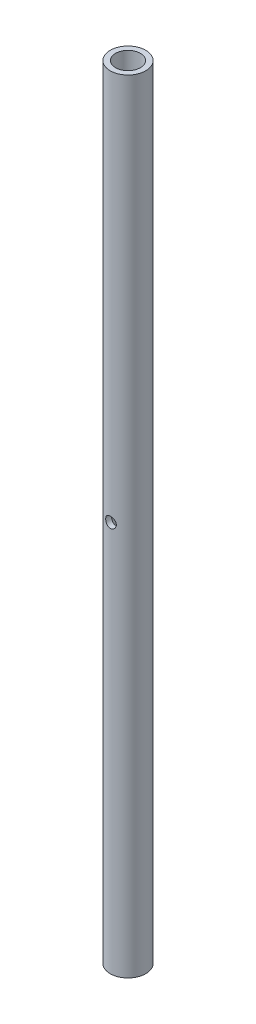
ISO-10303-21;
HEADER;
FILE_DESCRIPTION(('STEP AP214'),'2;1');
FILE_NAME('part.step','',(''),(''),'','','');
FILE_SCHEMA(('AUTOMOTIVE_DESIGN { 1 0 10303 214 1 1 1 1 }'));
ENDSEC;
DATA;
#1=APPLICATION_CONTEXT('core data for automotive mechanical design processes');
#2=APPLICATION_PROTOCOL_DEFINITION('international standard','automotive_design',2000,#1);
#3=PRODUCT_CONTEXT('',#1,'mechanical');
#4=PRODUCT('Part','Part','',(#3));
#5=PRODUCT_RELATED_PRODUCT_CATEGORY('part','',(#4));
#6=PRODUCT_DEFINITION_FORMATION('','',#4);
#7=PRODUCT_DEFINITION_CONTEXT('part definition',#1,'design');
#8=PRODUCT_DEFINITION('design','',#6,#7);
#9=PRODUCT_DEFINITION_SHAPE('','',#8);
#10=(LENGTH_UNIT() NAMED_UNIT(*) SI_UNIT(.MILLI.,.METRE.));
#11=(NAMED_UNIT(*) PLANE_ANGLE_UNIT() SI_UNIT($,.RADIAN.));
#12=(NAMED_UNIT(*) SI_UNIT($,.STERADIAN.) SOLID_ANGLE_UNIT());
#13=UNCERTAINTY_MEASURE_WITH_UNIT(LENGTH_MEASURE(1.E-05),#10,'distance_accuracy_value','');
#14=(GEOMETRIC_REPRESENTATION_CONTEXT(3) GLOBAL_UNCERTAINTY_ASSIGNED_CONTEXT((#13)) GLOBAL_UNIT_ASSIGNED_CONTEXT((#10,
#11,#12)) REPRESENTATION_CONTEXT('',''));
#15=CARTESIAN_POINT('',(0.,0.,0.));
#16=DIRECTION('',(0.,0.,1.));
#17=DIRECTION('',(1.,0.,0.));
#18=AXIS2_PLACEMENT_3D('',#15,#16,#17);
#19=CARTESIAN_POINT('',(0.,220.,0.));
#20=DIRECTION('',(0.,1.,0.));
#21=DIRECTION('',(0.,0.,1.));
#22=AXIS2_PLACEMENT_3D('',#19,#20,#21);
#23=PLANE('',#22);
#24=CARTESIAN_POINT('',(0.,220.,0.));
#25=DIRECTION('',(0.,1.,0.));
#26=DIRECTION('',(0.,0.,1.));
#27=AXIS2_PLACEMENT_3D('',#24,#25,#26);
#28=CIRCLE('',#27,5.);
#29=CARTESIAN_POINT('',(0.,220.,5.00000000000004));
#30=VERTEX_POINT('',#29);
#31=EDGE_CURVE('E10',#30,#30,#28,.T.);
#32=ORIENTED_EDGE('',*,*,#31,.T.);
#33=EDGE_LOOP('',(#32));
#34=FACE_BOUND('',#33,.T.);
#35=CARTESIAN_POINT('',(0.,220.,0.));
#36=DIRECTION('',(0.,1.,0.));
#37=DIRECTION('',(0.,0.,1.));
#38=AXIS2_PLACEMENT_3D('',#35,#36,#37);
#39=CIRCLE('',#38,3.5);
#40=CARTESIAN_POINT('',(0.,220.,3.50000000000004));
#41=VERTEX_POINT('',#40);
#42=EDGE_CURVE('E56',#41,#41,#39,.T.);
#43=ORIENTED_EDGE('',*,*,#42,.F.);
#44=EDGE_LOOP('',(#43));
#45=FACE_BOUND('',#44,.T.);
#46=ADVANCED_FACE('F37',(#34,#45),#23,.T.);
#47=CARTESIAN_POINT('',(0.,0.,0.));
#48=DIRECTION('',(0.,1.,0.));
#49=DIRECTION('',(0.,0.,1.));
#50=AXIS2_PLACEMENT_3D('',#47,#48,#49);
#51=PLANE('',#50);
#52=CARTESIAN_POINT('',(0.,0.,0.));
#53=DIRECTION('',(0.,1.,0.));
#54=DIRECTION('',(0.,0.,1.));
#55=AXIS2_PLACEMENT_3D('',#52,#53,#54);
#56=CIRCLE('',#55,5.);
#57=CARTESIAN_POINT('',(0.,0.,5.));
#58=VERTEX_POINT('',#57);
#59=EDGE_CURVE('E51',#58,#58,#56,.T.);
#60=ORIENTED_EDGE('',*,*,#59,.F.);
#61=EDGE_LOOP('',(#60));
#62=FACE_BOUND('',#61,.T.);
#63=CARTESIAN_POINT('',(0.,0.,0.));
#64=DIRECTION('',(0.,1.,0.));
#65=DIRECTION('',(0.,0.,1.));
#66=AXIS2_PLACEMENT_3D('',#63,#64,#65);
#67=CIRCLE('',#66,3.5);
#68=CARTESIAN_POINT('',(0.,0.,3.5));
#69=VERTEX_POINT('',#68);
#70=EDGE_CURVE('E59',#69,#69,#67,.T.);
#71=ORIENTED_EDGE('',*,*,#70,.T.);
#72=EDGE_LOOP('',(#71));
#73=FACE_BOUND('',#72,.T.);
#74=ADVANCED_FACE('F95',(#62,#73),#51,.F.);
#75=CARTESIAN_POINT('',(0.,220.,0.));
#76=DIRECTION('',(0.,-1.,0.));
#77=DIRECTION('',(0.,0.,-1.));
#78=AXIS2_PLACEMENT_3D('',#75,#76,#77);
#79=CYLINDRICAL_SURFACE('',#78,5.);
#80=CARTESIAN_POINT('',(0.,111.5,-4.99999999999998));
#81=CARTESIAN_POINT('',(-0.0822886127532941,111.499999002515,-4.99999929250547));
#82=CARTESIAN_POINT('',(-0.164587318351517,111.493206136376,-4.99794915693951));
#83=CARTESIAN_POINT('',(-0.326788125304859,111.466278645778,-4.98997105593687));
#84=CARTESIAN_POINT('',(-0.406689504411395,111.446140041977,-4.98404193389688));
#85=CARTESIAN_POINT('',(-0.561732707754496,111.39325398309,-4.96895552501832));
#86=CARTESIAN_POINT('',(-0.63688136439534,111.360525130381,-4.95980300250422));
#87=CARTESIAN_POINT('',(-0.780624181053079,111.283463906944,-4.93922109237642));
#88=CARTESIAN_POINT('',(-0.849217467469599,111.239129992605,-4.92779140192063));
#89=CARTESIAN_POINT('',(-0.979871797183681,111.138775992527,-4.9035073719277));
#90=CARTESIAN_POINT('',(-1.0417180712443,111.082483374114,-4.89062383657032));
#91=CARTESIAN_POINT('',(-1.15524920923322,110.96039077009,-4.8650583421044));
#92=CARTESIAN_POINT('',(-1.20693236327439,110.894589187875,-4.85237641724502));
#93=CARTESIAN_POINT('',(-1.29980037723707,110.753529246962,-4.82834113993772));
#94=CARTESIAN_POINT('',(-1.34072309022213,110.678091539009,-4.81702406663872));
#95=CARTESIAN_POINT('',(-1.4092139477476,110.52101074577,-4.79743620394027));
#96=CARTESIAN_POINT('',(-1.43678529919972,110.439369156072,-4.78916468313308));
#97=CARTESIAN_POINT('',(-1.47701633682651,110.27460973387,-4.77690870838433));
#98=CARTESIAN_POINT('',(-1.49007196234678,110.191597256136,-4.77281069324531));
#99=CARTESIAN_POINT('',(-1.50213730614671,110.024466843783,-4.76902789749762));
#100=CARTESIAN_POINT('',(-1.50115042761075,109.940349181941,-4.76934204760563));
#101=CARTESIAN_POINT('',(-1.48546977199808,109.776616091392,-4.7742474406777));
#102=CARTESIAN_POINT('',(-1.47127205262684,109.696947749638,-4.77868388599136));
#103=CARTESIAN_POINT('',(-1.43037420427057,109.541180213727,-4.79108356228621));
#104=CARTESIAN_POINT('',(-1.40367284141642,109.465081372626,-4.79904714132347));
#105=CARTESIAN_POINT('',(-1.33816026653682,109.317399650339,-4.81772733074968));
#106=CARTESIAN_POINT('',(-1.29918816934644,109.245892916045,-4.82848016115947));
#107=CARTESIAN_POINT('',(-1.21035222588683,109.11026797799,-4.85150987000062));
#108=CARTESIAN_POINT('',(-1.16048574002587,109.046151570586,-4.8637871174699));
#109=CARTESIAN_POINT('',(-1.04881290765545,108.924313809238,-4.88911011297936));
#110=CARTESIAN_POINT('',(-0.98659490746697,108.86697133597,-4.90216654310495));
#111=CARTESIAN_POINT('',(-0.853263259313978,108.763446015936,-4.92712244063254));
#112=CARTESIAN_POINT('',(-0.782149051860897,108.717263871586,-4.93902183518404));
#113=CARTESIAN_POINT('',(-0.632355038342811,108.637140077535,-4.96043160069465));
#114=CARTESIAN_POINT('',(-0.553627749747959,108.60328248375,-4.9699254366831));
#115=CARTESIAN_POINT('',(-0.391245415603523,108.5494004099,-4.98533521832219));
#116=CARTESIAN_POINT('',(-0.307591751589579,108.529372071468,-4.99125216186996));
#117=CARTESIAN_POINT('',(-0.140952242668326,108.504347822101,-4.99868364643534));
#118=CARTESIAN_POINT('',(-0.0580500976011848,108.498838414198,-5.00034850417786));
#119=CARTESIAN_POINT('',(0.10749960582338,108.501569155712,-4.99952923241756));
#120=CARTESIAN_POINT('',(0.190147196690777,108.509807469651,-4.99704565677754));
#121=CARTESIAN_POINT('',(0.350903605309698,108.539384611112,-4.9883069698716));
#122=CARTESIAN_POINT('',(0.429072772614176,108.560423387581,-4.98213829799413));
#123=CARTESIAN_POINT('',(0.580754638954547,108.614643232778,-4.96674347841529));
#124=CARTESIAN_POINT('',(0.654266777025621,108.647825761038,-4.95751696321083));
#125=CARTESIAN_POINT('',(0.796437189461088,108.726253165481,-4.93669654351323));
#126=CARTESIAN_POINT('',(0.86494382619969,108.771759340948,-4.92505280829671));
#127=CARTESIAN_POINT('',(0.99352330798014,108.873224754053,-4.90073468764315));
#128=CARTESIAN_POINT('',(1.05359403235591,108.929186611888,-4.88806004431081));
#129=CARTESIAN_POINT('',(1.16585744551026,109.052387308369,-4.8625317186914));
#130=CARTESIAN_POINT('',(1.21768481231504,109.119961875772,-4.84968825033266));
#131=CARTESIAN_POINT('',(1.30928995072154,109.263127939014,-4.82576515238458));
#132=CARTESIAN_POINT('',(1.34906803829471,109.338719224558,-4.81468547654645));
#133=CARTESIAN_POINT('',(1.41517347127167,109.495532491255,-4.7956718961505));
#134=CARTESIAN_POINT('',(1.4415634693705,109.576726186537,-4.78772337843824));
#135=CARTESIAN_POINT('',(1.48021730815115,109.742687968931,-4.7759159436279));
#136=CARTESIAN_POINT('',(1.4924859897878,109.827454820788,-4.77205562508292));
#137=CARTESIAN_POINT('',(1.50221984485059,109.994361518376,-4.76899972496077));
#138=CARTESIAN_POINT('',(1.5002805530849,110.076463651018,-4.76961647442748));
#139=CARTESIAN_POINT('',(1.48307505444814,110.239114103373,-4.77499401288294));
#140=CARTESIAN_POINT('',(1.46780938124717,110.319662485176,-4.77975463592554));
#141=CARTESIAN_POINT('',(1.42476888804136,110.475945399143,-4.79275763670388));
#142=CARTESIAN_POINT('',(1.39715175507067,110.551727287362,-4.80095604545963));
#143=CARTESIAN_POINT('',(1.33031507121129,110.697642438818,-4.81990278909132));
#144=CARTESIAN_POINT('',(1.29109329962878,110.767774617641,-4.83065161194307));
#145=CARTESIAN_POINT('',(1.20048763805074,110.903163116527,-4.8539767642583));
#146=CARTESIAN_POINT('',(1.14871276092993,110.96814876126,-4.86660540163795));
#147=CARTESIAN_POINT('',(1.03517434629782,111.088702498308,-4.89201320450022));
#148=CARTESIAN_POINT('',(0.97340821713453,111.144268139468,-4.90479240823899));
#149=CARTESIAN_POINT('',(0.839465762183285,111.246023412295,-4.92950936570643));
#150=CARTESIAN_POINT('',(0.767037885790625,111.291891446855,-4.94141159765671));
#151=CARTESIAN_POINT('',(0.615141373983525,111.370735169904,-4.96260680455809));
#152=CARTESIAN_POINT('',(0.535676052998948,111.403716888275,-4.97190099931059));
#153=CARTESIAN_POINT('',(0.380757712655271,111.452895275653,-4.98602174969294));
#154=CARTESIAN_POINT('',(0.305786961954224,111.470511672883,-4.99122027381063));
#155=CARTESIAN_POINT('',(0.153880195230773,111.494063525242,-4.9982094449449));
#156=CARTESIAN_POINT('',(0.0769445098581361,111.500000932705,-5.00000066154738));
#157=CARTESIAN_POINT('',(0.,111.5,-4.99999999999998));
#158=B_SPLINE_CURVE_WITH_KNOTS('',3,(#80,#81,#82,#83,#84,#85,#86,#87,#88,#89,#90,#91,#92,#93,
#94,#95,#96,#97,#98,#99,#100,#101,#102,#103,#104,#105,#106,#107,#108,#109,#110,#111,#112,#113,
#114,#115,#116,#117,#118,#119,#120,#121,#122,#123,#124,#125,#126,#127,#128,#129,#130,#131,#132,
#133,#134,#135,#136,#137,#138,#139,#140,#141,#142,#143,#144,#145,#146,#147,#148,#149,#150,#151,
#152,#153,#154,#155,#156,#157),.UNSPECIFIED.,.T.,.F.,(4,2,2,2,2,2,2,2,2,2,2,2,2,2,2,2,2,2,2,2,2,
2,2,2,2,2,2,2,2,2,2,2,2,2,2,2,2,2,4),(0.,0.246583203612597,0.493239964845971,0.739533676300826,
0.985860164412638,1.23855602948188,1.49129437288631,1.74971481004107,2.00807314543224,
2.25919689356597,2.51025978319085,2.75226016697674,2.99428443657999,3.23962426447117,
3.48502360158555,3.74067104048164,3.99633456531068,4.25371046881686,4.51101453528806,
4.75908809438543,5.00712853550324,5.24956746682326,5.4920355459373,5.74011305702907,
5.98825282000187,6.24540400322819,6.50254844252679,6.7584781495125,7.01432009460281,
7.25950155466941,7.504673196616,7.74680040402723,7.98897397553108,8.23996925679929,
8.49102974897499,8.74942996156669,9.00770911595235,9.23831691930459,9.46888616948874),.UNSPECIFIED.);
#159=CARTESIAN_POINT('',(0.,111.5,-4.99999999999998));
#160=VERTEX_POINT('',#159);
#161=EDGE_CURVE('E84',#160,#160,#158,.T.);
#162=ORIENTED_EDGE('',*,*,#161,.T.);
#163=EDGE_LOOP('',(#162));
#164=FACE_BOUND('',#163,.T.);
#165=CARTESIAN_POINT('',(1.49999999999997,110.,4.76969600708482));
#166=CARTESIAN_POINT('',(1.49999897633761,109.917805452058,4.76969685726989));
#167=CARTESIAN_POINT('',(1.49322108167141,109.835600775856,4.77184390209073));
#168=CARTESIAN_POINT('',(1.46635844446751,109.673594750408,4.78016578302902));
#169=CARTESIAN_POINT('',(1.4462692557358,109.593794213499,4.78634196493473));
#170=CARTESIAN_POINT('',(1.39352753269958,109.438965271728,4.80196102485639));
#171=CARTESIAN_POINT('',(1.36089589394245,109.363929170367,4.81139846703237));
#172=CARTESIAN_POINT('',(1.28406421917929,109.220378066005,4.83246932547569));
#173=CARTESIAN_POINT('',(1.23986245137051,109.151864041316,4.84410307041021));
#174=CARTESIAN_POINT('',(1.13964754141625,109.021133609423,4.86866862185768));
#175=CARTESIAN_POINT('',(1.08333207175806,108.959154102054,4.8816280831164));
#176=CARTESIAN_POINT('',(0.961136237579591,108.845362048677,4.9071486193676));
#177=CARTESIAN_POINT('',(0.895254645461087,108.79355080955,4.91970964297704));
#178=CARTESIAN_POINT('',(0.754111437793666,108.700537300167,4.94333214579388));
#179=CARTESIAN_POINT('',(0.678684021335809,108.659576575557,4.95435724342407));
#180=CARTESIAN_POINT('',(0.521624645369359,108.591012740957,4.97334435920688));
#181=CARTESIAN_POINT('',(0.439994028387909,108.563406750143,4.98130703789497));
#182=CARTESIAN_POINT('',(0.275323852630824,108.52311999891,4.99307646003591));
#183=CARTESIAN_POINT('',(0.192391398953801,108.510034872347,4.99699557369342));
#184=CARTESIAN_POINT('',(0.0254218237493188,108.497882675354,5.00063201501351));
#185=CARTESIAN_POINT('',(-0.0586150620503662,108.498812660598,5.00035022521079));
#186=CARTESIAN_POINT('',(-0.222571156600175,108.514392868543,4.99569603817658));
#187=CARTESIAN_POINT('',(-0.30253626764137,108.52860519381,4.99145420205263));
#188=CARTESIAN_POINT('',(-0.458889213442572,108.569631335994,4.97951522112597));
#189=CARTESIAN_POINT('',(-0.535276821322894,108.596445950943,4.97181785750588));
#190=CARTESIAN_POINT('',(-0.683347326351325,108.662212023419,4.95365220986965));
#191=CARTESIAN_POINT('',(-0.754965064694517,108.701301202807,4.94315269676709));
#192=CARTESIAN_POINT('',(-0.890764673783169,108.790397852428,4.92049640648071));
#193=CARTESIAN_POINT('',(-0.954944774872124,108.840407912963,4.90833923637778));
#194=CARTESIAN_POINT('',(-1.07666048152979,108.952197750752,4.88311550488166));
#195=CARTESIAN_POINT('',(-1.13384458040113,109.01435691903,4.87003195321464));
#196=CARTESIAN_POINT('',(-1.23707651539824,109.14751001789,4.844839798875));
#197=CARTESIAN_POINT('',(-1.28312324482851,109.218504825389,4.83273129317019));
#198=CARTESIAN_POINT('',(-1.36313995335448,109.368239469249,4.81077903197676));
#199=CARTESIAN_POINT('',(-1.3969898923768,109.447047045863,4.80095810695958));
#200=CARTESIAN_POINT('',(-1.45083362878415,109.609607208446,4.7849639254844));
#201=CARTESIAN_POINT('',(-1.4708319464056,109.693358171535,4.77878947915834));
#202=CARTESIAN_POINT('',(-1.49574770282165,109.860082360739,4.77104849541247));
#203=CARTESIAN_POINT('',(-1.50119946380213,109.942968223894,4.76931878670445));
#204=CARTESIAN_POINT('',(-1.49835947233061,110.10847290001,4.77021192441925));
#205=CARTESIAN_POINT('',(-1.49006964371324,110.191091748731,4.77283416156587));
#206=CARTESIAN_POINT('',(-1.46045763574183,110.351488377971,4.7819755855491));
#207=CARTESIAN_POINT('',(-1.43947961431277,110.429336164264,4.78839176507491));
#208=CARTESIAN_POINT('',(-1.38548577747941,110.580401690815,4.80429141231232));
#209=CARTESIAN_POINT('',(-1.3524681034276,110.653618714141,4.81377535359076));
#210=CARTESIAN_POINT('',(-1.274318711965,110.795517464072,4.83505835023049));
#211=CARTESIAN_POINT('',(-1.22888564172727,110.864024720986,4.84691271069803));
#212=CARTESIAN_POINT('',(-1.12755301600382,110.992638106181,4.87148205646991));
#213=CARTESIAN_POINT('',(-1.07165095534893,111.052742217613,4.88419724730004));
#214=CARTESIAN_POINT('',(-0.948455132493556,111.165180405815,4.90963633548159));
#215=CARTESIAN_POINT('',(-0.880811065857384,111.217135628987,4.92234245063008));
#216=CARTESIAN_POINT('',(-0.737461784590195,111.308966701028,4.94584851748655));
#217=CARTESIAN_POINT('',(-0.661756970543894,111.348843149782,4.9566485638472));
#218=CARTESIAN_POINT('',(-0.504935504705169,111.415000030568,4.9750597047496));
#219=CARTESIAN_POINT('',(-0.423864622037782,111.441382016159,4.98269453424969));
#220=CARTESIAN_POINT('',(-0.258169966504536,111.48006091889,4.99401979596831));
#221=CARTESIAN_POINT('',(-0.17354721735472,111.492361865948,4.99771135670885));
#222=CARTESIAN_POINT('',(-0.00665215388271418,111.502223044055,5.00066544081403));
#223=CARTESIAN_POINT('',(0.075585179086231,111.500332695408,5.00009305111325));
#224=CARTESIAN_POINT('',(0.238519481164423,111.483178367501,4.99497264465041));
#225=CARTESIAN_POINT('',(0.319216537346548,111.46791514652,4.99042485330469));
#226=CARTESIAN_POINT('',(0.475935813041374,111.4247883386,4.97791168358333));
#227=CARTESIAN_POINT('',(0.551998927351405,111.397061819351,4.9699835290087));
#228=CARTESIAN_POINT('',(0.698433237752065,111.329918085493,4.95152943039453));
#229=CARTESIAN_POINT('',(0.768803496050593,111.290498949714,4.9410030594995));
#230=CARTESIAN_POINT('',(0.904301892420578,111.19962654257,4.91803965828233));
#231=CARTESIAN_POINT('',(0.96919025007678,111.147828569999,4.90555226923564));
#232=CARTESIAN_POINT('',(1.08953757134596,111.034289611667,4.88023537212336));
#233=CARTESIAN_POINT('',(1.14499380960195,110.972545762102,4.8674057664108));
#234=CARTESIAN_POINT('',(1.24656269394549,110.838659221689,4.84240680631321));
#235=CARTESIAN_POINT('',(1.29234759757956,110.76626144661,4.8302685269349));
#236=CARTESIAN_POINT('',(1.37104313528777,110.614444825839,4.80852547508796));
#237=CARTESIAN_POINT('',(1.40395995557292,110.535029376399,4.79891948596954));
#238=CARTESIAN_POINT('',(1.45301942532953,110.380259568394,4.78427816717592));
#239=CARTESIAN_POINT('',(1.47058859011233,110.305391353069,4.77886154840521));
#240=CARTESIAN_POINT('',(1.49407818835143,110.153684777504,4.77157042597173));
#241=CARTESIAN_POINT('',(1.50000095706093,110.076846815355,4.7696952122144));
#242=CARTESIAN_POINT('',(1.49999999999997,110.,4.76969600708482));
#243=B_SPLINE_CURVE_WITH_KNOTS('',3,(#165,#166,#167,#168,#169,#170,#171,#172,#173,#174,#175,
#176,#177,#178,#179,#180,#181,#182,#183,#184,#185,#186,#187,#188,#189,#190,#191,#192,#193,#194,
#195,#196,#197,#198,#199,#200,#201,#202,#203,#204,#205,#206,#207,#208,#209,#210,#211,#212,#213,
#214,#215,#216,#217,#218,#219,#220,#221,#222,#223,#224,#225,#226,#227,#228,#229,#230,#231,#232,
#233,#234,#235,#236,#237,#238,#239,#240,#241,#242),.UNSPECIFIED.,.T.,.F.,(4,2,2,2,2,2,2,2,2,2,2,
2,2,2,2,2,2,2,2,2,2,2,2,2,2,2,2,2,2,2,2,2,2,2,2,2,2,2,4),(0.,0.246300165915559,
0.492682641689013,0.738656414466202,0.984667025370109,1.23773150007987,1.49082847871276,
1.74915939273646,2.00743455587877,2.25832140149558,2.50915554101441,2.75200125990883,
2.99486235890382,3.24055209335679,3.48630016590829,3.74152147023279,3.99676812491865,
4.25446238246268,4.51207250628414,4.76008080790311,5.00805439107388,5.24958594938818,
5.49115481045789,5.7392073180939,5.98731925928925,6.24479506100607,6.50225807324207,
6.75775391814329,7.01317662321685,7.25876303911221,7.50433553047755,7.7472709687222,
7.99024634491379,8.24099627054489,8.4918185262989,8.75011639669147,9.00828993963945,
9.23861153857446,9.46888695033557),.UNSPECIFIED.);
#244=CARTESIAN_POINT('',(1.49999999999997,110.,4.76969600708482));
#245=VERTEX_POINT('',#244);
#246=EDGE_CURVE('E79',#245,#245,#243,.T.);
#247=ORIENTED_EDGE('',*,*,#246,.T.);
#248=EDGE_LOOP('',(#247));
#249=FACE_BOUND('',#248,.T.);
#250=ORIENTED_EDGE('',*,*,#31,.F.);
#251=EDGE_LOOP('',(#250));
#252=FACE_BOUND('',#251,.T.);
#253=ORIENTED_EDGE('',*,*,#59,.T.);
#254=EDGE_LOOP('',(#253));
#255=FACE_BOUND('',#254,.T.);
#256=ADVANCED_FACE('F39',(#164,#249,#252,#255),#79,.T.);
#257=CARTESIAN_POINT('',(0.,220.,0.));
#258=DIRECTION('',(0.,-1.,0.));
#259=DIRECTION('',(0.,0.,-1.));
#260=AXIS2_PLACEMENT_3D('',#257,#258,#259);
#261=CYLINDRICAL_SURFACE('',#260,3.5);
#262=CARTESIAN_POINT('',(0.,111.5,-3.49999999999998));
#263=CARTESIAN_POINT('',(-0.0801521976823534,111.499990778561,-3.49999299268886));
#264=CARTESIAN_POINT('',(-0.160419992198193,111.493537870244,-3.49721516409709));
#265=CARTESIAN_POINT('',(-0.318671611361169,111.467960292715,-3.4863706920486));
#266=CARTESIAN_POINT('',(-0.396649149090537,111.44880363021,-3.47829069608743));
#267=CARTESIAN_POINT('',(-0.547768164746371,111.398664724801,-3.457707863367));
#268=CARTESIAN_POINT('',(-0.620925386146692,111.367723472537,-3.44522036823862));
#269=CARTESIAN_POINT('',(-0.760936446071861,111.29506789625,-3.41702837926817));
#270=CARTESIAN_POINT('',(-0.827791985611415,111.253356490849,-3.40132475720835));
#271=CARTESIAN_POINT('',(-0.956920783546124,111.158036145875,-3.36733908702929));
#272=CARTESIAN_POINT('',(-1.01882024425243,111.103952361922,-3.34896947381211));
#273=CARTESIAN_POINT('',(-1.13299518436928,110.986428073884,-3.31208827769687));
#274=CARTESIAN_POINT('',(-1.18526532055665,110.92298240993,-3.29357662187916));
#275=CARTESIAN_POINT('',(-1.28142843548187,110.784483636294,-3.25741027462358));
#276=CARTESIAN_POINT('',(-1.32473406006014,110.708994770358,-3.23985230076496));
#277=CARTESIAN_POINT('',(-1.39786599574423,110.550945286533,-3.20898084363447));
#278=CARTESIAN_POINT('',(-1.42769964537363,110.46838854792,-3.195665050707));
#279=CARTESIAN_POINT('',(-1.47147459991436,110.302849630691,-3.17573899533532));
#280=CARTESIAN_POINT('',(-1.48613747209694,110.220096149073,-3.16882610719814));
#281=CARTESIAN_POINT('',(-1.50140303570396,110.053037015232,-3.16162424842015));
#282=CARTESIAN_POINT('',(-1.50201414304564,109.96873232235,-3.16133131294296));
#283=CARTESIAN_POINT('',(-1.48969999758095,109.808350048151,-3.16714786968015));
#284=CARTESIAN_POINT('',(-1.47788056910827,109.732164688394,-3.17273435527603));
#285=CARTESIAN_POINT('',(-1.44290386406529,109.582986207111,-3.18879205821453));
#286=CARTESIAN_POINT('',(-1.41974426417224,109.509993743071,-3.19926427650309));
#287=CARTESIAN_POINT('',(-1.36228829534659,109.367376424262,-3.22415342810441));
#288=CARTESIAN_POINT('',(-1.32775987214029,109.297859852886,-3.23865147551045));
#289=CARTESIAN_POINT('',(-1.24871152436694,109.165326837971,-3.26994246945708));
#290=CARTESIAN_POINT('',(-1.204187537403,109.102313052537,-3.28673634798106));
#291=CARTESIAN_POINT('',(-1.10171702696063,108.978611248188,-3.32256202266191));
#292=CARTESIAN_POINT('',(-1.04292364428055,108.918641635264,-3.3416592769422));
#293=CARTESIAN_POINT('',(-0.915936662025548,108.809164204672,-3.37867302879637));
#294=CARTESIAN_POINT('',(-0.847740608139993,108.759659127061,-3.39658921627429));
#295=CARTESIAN_POINT('',(-0.701592911506317,108.671378033596,-3.42979846844681));
#296=CARTESIAN_POINT('',(-0.623435574851158,108.632910490647,-3.44501227516833));
#297=CARTESIAN_POINT('',(-0.460939847079495,108.569924881193,-3.47048698130302));
#298=CARTESIAN_POINT('',(-0.376605107828848,108.545398647011,-3.48075078019993));
#299=CARTESIAN_POINT('',(-0.210138119470691,108.51253306977,-3.49461763446682));
#300=CARTESIAN_POINT('',(-0.128228980505469,108.503230617343,-3.49861624982289));
#301=CARTESIAN_POINT('',(0.0360716505592776,108.498185211796,-3.50077708325868));
#302=CARTESIAN_POINT('',(0.118462985950333,108.502438073734,-3.4989411026583));
#303=CARTESIAN_POINT('',(0.276771219813335,108.523707816027,-3.48989338160072));
#304=CARTESIAN_POINT('',(0.352799465752026,108.540034160724,-3.48297259736819));
#305=CARTESIAN_POINT('',(0.500945568196336,108.584010447119,-3.46476944004982));
#306=CARTESIAN_POINT('',(0.573062936850428,108.611661797861,-3.45348652424252));
#307=CARTESIAN_POINT('',(0.713888482618997,108.678400579751,-3.42719375756861));
#308=CARTESIAN_POINT('',(0.782419874757537,108.717818165114,-3.41207852694252));
#309=CARTESIAN_POINT('',(0.912142452825191,108.806609472237,-3.37971494195697));
#310=CARTESIAN_POINT('',(0.973330487571142,108.855987444009,-3.36246567824307));
#311=CARTESIAN_POINT('',(1.09148379765635,108.967644793924,-3.32607394349018));
#312=CARTESIAN_POINT('',(1.14778308774279,109.03061610504,-3.30688677499568));
#313=CARTESIAN_POINT('',(1.24921715724403,109.165391149307,-3.26992018844847));
#314=CARTESIAN_POINT('',(1.29434883220193,109.237197330153,-3.25214116277358));
#315=CARTESIAN_POINT('',(1.37281937806384,109.389406926514,-3.21981484643714));
#316=CARTESIAN_POINT('',(1.40593207473353,109.469941504657,-3.20533127997691));
#317=CARTESIAN_POINT('',(1.45782942550894,109.636263163238,-3.182068037611));
#318=CARTESIAN_POINT('',(1.47662682249984,109.722045498671,-3.17328328988831));
#319=CARTESIAN_POINT('',(1.49805974083907,109.888995586619,-3.16321740581932));
#320=CARTESIAN_POINT('',(1.50187346166243,109.96997963538,-3.16138962881676));
#321=CARTESIAN_POINT('',(1.49641325085792,110.131394871832,-3.16397809086749));
#322=CARTESIAN_POINT('',(1.4871416274869,110.211826154515,-3.16839322866986));
#323=CARTESIAN_POINT('',(1.45678214099442,110.365520853866,-3.18245827118031));
#324=CARTESIAN_POINT('',(1.4363348201338,110.438939416647,-3.19182357178314));
#325=CARTESIAN_POINT('',(1.38485117000436,110.581310362174,-3.21449437287186));
#326=CARTESIAN_POINT('',(1.35381183006241,110.650261468453,-3.22780099349554));
#327=CARTESIAN_POINT('',(1.27981602227025,110.786410436908,-3.25787626150963));
#328=CARTESIAN_POINT('',(1.23624027712768,110.85323489382,-3.27480834339629));
#329=CARTESIAN_POINT('',(1.13924888881305,110.978990863531,-3.30979879908536));
#330=CARTESIAN_POINT('',(1.08582952534296,111.037919377544,-3.32785759700643));
#331=CARTESIAN_POINT('',(0.965671675541785,111.151003097314,-3.3647775087714));
#332=CARTESIAN_POINT('',(0.898214817981356,111.204414733869,-3.38358948911934));
#333=CARTESIAN_POINT('',(0.754612613706944,111.299214926693,-3.41848089249466));
#334=CARTESIAN_POINT('',(0.678463349382736,111.34059803175,-3.43455907522588));
#335=CARTESIAN_POINT('',(0.520626802896603,111.409344569571,-3.46197513636856));
#336=CARTESIAN_POINT('',(0.439036402858219,111.436903529979,-3.47337868320289));
#337=CARTESIAN_POINT('',(0.271925657404356,111.477634714767,-3.49042295491401));
#338=CARTESIAN_POINT('',(0.186418352711351,111.490851509647,-3.49608152963074));
#339=CARTESIAN_POINT('',(0.0670267606132575,111.498880510954,-3.49952115812378));
#340=CARTESIAN_POINT('',(0.0335234910607973,111.500003856848,-3.50000293079337));
#341=CARTESIAN_POINT('',(0.,111.5,-3.49999999999998));
#342=B_SPLINE_CURVE_WITH_KNOTS('',3,(#262,#263,#264,#265,#266,#267,#268,#269,#270,#271,#272,
#273,#274,#275,#276,#277,#278,#279,#280,#281,#282,#283,#284,#285,#286,#287,#288,#289,#290,#291,
#292,#293,#294,#295,#296,#297,#298,#299,#300,#301,#302,#303,#304,#305,#306,#307,#308,#309,#310,
#311,#312,#313,#314,#315,#316,#317,#318,#319,#320,#321,#322,#323,#324,#325,#326,#327,#328,#329,
#330,#331,#332,#333,#334,#335,#336,#337,#338,#339,#340,#341),.UNSPECIFIED.,.T.,.F.,(4,2,2,2,2,2,
2,2,2,2,2,2,2,2,2,2,2,2,2,2,2,2,2,2,2,2,2,2,2,2,2,2,2,2,2,2,2,2,2,4),(0.,0.240357161374431,
0.481321951711683,0.721456131375727,0.961525304807674,1.21311371779255,1.46484131710875,
1.72984780430036,1.99470976114136,2.24629713414054,2.49773382188961,2.7285536015981,
2.95942069041219,3.19532704432405,3.43132944942386,3.68854918859165,3.94583619550728,
4.20973622296864,4.47348148178617,4.71978673747263,4.96601595851036,5.19915597113066,
5.43232499957128,5.67277527577351,5.91332836788294,6.17201425189607,6.43077196675488,
6.69417345394938,6.95734019712954,7.19934244432582,7.4413020076215,7.67066022550948,
7.90008369050328,8.14372375039562,8.38745608120083,8.65042084666965,8.91350460007062,
9.17275427816971,9.43119596989058,9.53172485598112),.UNSPECIFIED.);
#343=CARTESIAN_POINT('',(0.,111.5,-3.49999999999998));
#344=VERTEX_POINT('',#343);
#345=EDGE_CURVE('E42',#344,#344,#342,.T.);
#346=ORIENTED_EDGE('',*,*,#345,.F.);
#347=EDGE_LOOP('',(#346));
#348=FACE_BOUND('',#347,.T.);
#349=CARTESIAN_POINT('',(1.49999999999997,110.,3.16227766016845));
#350=CARTESIAN_POINT('',(1.49999038492543,109.920231066955,3.16228717298625));
#351=CARTESIAN_POINT('',(1.49359660659693,109.840341858358,3.1653401801308));
#352=CARTESIAN_POINT('',(1.46827542593982,109.682883336926,3.17716042981267));
#353=CARTESIAN_POINT('',(1.44931491353817,109.605320719861,3.18594276667927));
#354=CARTESIAN_POINT('',(1.39974825661801,109.455084058202,3.20802619745325));
#355=CARTESIAN_POINT('',(1.3691914561727,109.382390814656,3.22130811955258));
#356=CARTESIAN_POINT('',(1.29744502147728,109.243182070564,3.25086693275561));
#357=CARTESIAN_POINT('',(1.25625747429104,109.176665360903,3.26714323581243));
#358=CARTESIAN_POINT('',(1.16151711863134,109.047275084383,3.30205565130511));
#359=CARTESIAN_POINT('',(1.10737213961855,108.984857269185,3.3207746765324));
#360=CARTESIAN_POINT('',(0.989495816865013,108.8696486676,3.35778390832694));
#361=CARTESIAN_POINT('',(0.925760668427737,108.816861720529,3.37607394135682));
#362=CARTESIAN_POINT('',(0.78688744411856,108.720040495364,3.41118222051015));
#363=CARTESIAN_POINT('',(0.71135772675508,108.676525404869,3.42789293367334));
#364=CARTESIAN_POINT('',(0.553203581147178,108.603017885784,3.45693710877233));
#365=CARTESIAN_POINT('',(0.470582497238463,108.573019124067,3.46927262014751));
#366=CARTESIAN_POINT('',(0.305382130945839,108.529067489439,3.48758735586717));
#367=CARTESIAN_POINT('',(0.223047558846208,108.514326967517,3.49387724164575));
#368=CARTESIAN_POINT('',(0.0568497000057915,108.498758649606,3.50052462942358));
#369=CARTESIAN_POINT('',(-0.0270129128697071,108.497924862622,3.50088468598073));
#370=CARTESIAN_POINT('',(-0.188134207596845,108.50979512439,3.49581016618038));
#371=CARTESIAN_POINT('',(-0.265470719086082,108.521631899974,3.49074679776833));
#372=CARTESIAN_POINT('',(-0.416935858912378,108.557012034327,3.47591102813448));
#373=CARTESIAN_POINT('',(-0.491064249746515,108.580556258213,3.46613827891649));
#374=CARTESIAN_POINT('',(-0.635378985342425,108.638953294863,3.44263346664965));
#375=CARTESIAN_POINT('',(-0.705487647305017,108.673973646175,3.42884310391309));
#376=CARTESIAN_POINT('',(-0.839017665141804,108.754158677678,3.39863837501698));
#377=CARTESIAN_POINT('',(-0.902436606512506,108.799327002266,3.38222306678433));
#378=CARTESIAN_POINT('',(-1.02577392003803,108.902404753343,3.34696895152062));
#379=CARTESIAN_POINT('',(-1.08508648843665,108.961009434896,3.32804069559211));
#380=CARTESIAN_POINT('',(-1.19331308888253,109.087351415816,3.29078815665827));
#381=CARTESIAN_POINT('',(-1.24222263226402,109.155092636874,3.27246413723676));
#382=CARTESIAN_POINT('',(-1.32993971380646,109.300889937261,3.23783417736943));
#383=CARTESIAN_POINT('',(-1.36831384702014,109.379232072845,3.22162619167358));
#384=CARTESIAN_POINT('',(-1.43107385954866,109.542144504279,3.19424697319985));
#385=CARTESIAN_POINT('',(-1.45547041320367,109.626709991661,3.18307189830846));
#386=CARTESIAN_POINT('',(-1.48799335058112,109.793586397784,3.16799275229808));
#387=CARTESIAN_POINT('',(-1.49710640039853,109.875664490298,3.16364898851203));
#388=CARTESIAN_POINT('',(-1.50171565988818,110.04027448756,3.16146494308518));
#389=CARTESIAN_POINT('',(-1.49721705457358,110.122806207555,3.16362218505065));
#390=CARTESIAN_POINT('',(-1.4756323920882,110.27993128687,3.17374071577831));
#391=CARTESIAN_POINT('',(-1.45944230541441,110.354677870185,3.18128847435205));
#392=CARTESIAN_POINT('',(-1.41614006363833,110.500322738185,3.20079786500714));
#393=CARTESIAN_POINT('',(-1.38902525529708,110.571220083273,3.21276056926753));
#394=CARTESIAN_POINT('',(-1.32334189052692,110.710604945145,3.2403833362419));
#395=CARTESIAN_POINT('',(-1.28432659707739,110.778853660909,3.25618154123651));
#396=CARTESIAN_POINT('',(-1.19638562157081,110.908175352757,3.28950916992054));
#397=CARTESIAN_POINT('',(-1.14745548114542,110.969245081105,3.30703937060574));
#398=CARTESIAN_POINT('',(-1.03605747720154,111.08801446278,3.34369698282834));
#399=CARTESIAN_POINT('',(-0.97278180241912,111.144957618586,3.36283055507216));
#400=CARTESIAN_POINT('',(-0.83714233452464,111.247567118664,3.3991347374908));
#401=CARTESIAN_POINT('',(-0.764777632276156,111.293232333494,3.41630515097059));
#402=CARTESIAN_POINT('',(-0.612290393672584,111.372041344805,3.44690719585063));
#403=CARTESIAN_POINT('',(-0.532131490582559,111.405122522776,3.46032004460387));
#404=CARTESIAN_POINT('',(-0.366659881518563,111.457074899446,3.48173830246703));
#405=CARTESIAN_POINT('',(-0.281350477650406,111.475955100376,3.4897471369377));
#406=CARTESIAN_POINT('',(-0.114740191834882,111.497788728807,3.49904040627996));
#407=CARTESIAN_POINT('',(-0.0336030421542954,111.501806905678,3.50077418524237));
#408=CARTESIAN_POINT('',(0.128169808807178,111.496702245211,3.49858700907226));
#409=CARTESIAN_POINT('',(0.208805604242796,111.48758195505,3.49466715001974));
#410=CARTESIAN_POINT('',(0.364022405138294,111.457223231529,3.48185611932801));
#411=CARTESIAN_POINT('',(0.438716867066051,111.43647301629,3.4731655061021));
#412=CARTESIAN_POINT('',(0.583524431853943,111.383991968078,3.45179100848824));
#413=CARTESIAN_POINT('',(0.65363668867,111.352259114076,3.43910638916067));
#414=CARTESIAN_POINT('',(0.790820855389608,111.277104822088,3.41024047270085));
#415=CARTESIAN_POINT('',(0.857608099366136,111.233216147387,3.3939260440718));
#416=CARTESIAN_POINT('',(0.983159576175442,111.135660035271,3.3597081162074));
#417=CARTESIAN_POINT('',(1.04192061850002,111.081988728822,3.34180398968808));
#418=CARTESIAN_POINT('',(1.15419921481672,110.961804491391,3.30477972078031));
#419=CARTESIAN_POINT('',(1.20702595263291,110.89464199188,3.28566570654985));
#420=CARTESIAN_POINT('',(1.30078077887622,110.751840742458,3.24969238680828));
#421=CARTESIAN_POINT('',(1.34170194259385,110.676197094897,3.2328343965475));
#422=CARTESIAN_POINT('',(1.41018371094568,110.518426430085,3.20355631016096));
#423=CARTESIAN_POINT('',(1.43776832759537,110.436311376865,3.1911282487781));
#424=CARTESIAN_POINT('',(1.47837340972955,110.268044820085,3.17252771438393));
#425=CARTESIAN_POINT('',(1.49144272805061,110.181907879047,3.16633426473114));
#426=CARTESIAN_POINT('',(1.49899243118198,110.063601155078,3.16275406284908));
#427=CARTESIAN_POINT('',(1.50000383428563,110.03181014091,3.16227386666059));
#428=CARTESIAN_POINT('',(1.49999999999997,110.,3.16227766016845));
#429=B_SPLINE_CURVE_WITH_KNOTS('',3,(#349,#350,#351,#352,#353,#354,#355,#356,#357,#358,#359,
#360,#361,#362,#363,#364,#365,#366,#367,#368,#369,#370,#371,#372,#373,#374,#375,#376,#377,#378,
#379,#380,#381,#382,#383,#384,#385,#386,#387,#388,#389,#390,#391,#392,#393,#394,#395,#396,#397,
#398,#399,#400,#401,#402,#403,#404,#405,#406,#407,#408,#409,#410,#411,#412,#413,#414,#415,#416,
#417,#418,#419,#420,#421,#422,#423,#424,#425,#426,#427,#428),.UNSPECIFIED.,.T.,.F.,(4,2,2,2,2,2,
2,2,2,2,2,2,2,2,2,2,2,2,2,2,2,2,2,2,2,2,2,2,2,2,2,2,2,2,2,2,2,2,2,4),(0.,0.239211516998644,
0.479055812925286,0.717890772651923,0.956678879115811,1.20974703533053,1.46291585698785,
1.72782087173738,1.99260163484397,2.24290515697653,2.49310084605817,2.72720452587284,
2.96132550725885,3.19902917219046,3.43681833943189,3.69219429883401,3.94768022455395,
4.21248245374583,4.47708218938957,4.723829875421,4.97048358104407,5.20000580849603,
5.42958381263242,5.66914358774553,5.90881132472034,6.16934837221381,6.4299115008954,
6.69175474679386,6.9534318657733,7.19595274449671,7.43842661162276,7.67141114258536,
7.90443857025997,8.1480979132595,8.39185383353304,8.6533139276367,8.91492579368379,
9.17606486564861,9.43632235654431,9.53171478279882),.UNSPECIFIED.);
#430=CARTESIAN_POINT('',(1.49999999999997,110.,3.16227766016845));
#431=VERTEX_POINT('',#430);
#432=EDGE_CURVE('E61',#431,#431,#429,.T.);
#433=ORIENTED_EDGE('',*,*,#432,.F.);
#434=EDGE_LOOP('',(#433));
#435=FACE_BOUND('',#434,.T.);
#436=ORIENTED_EDGE('',*,*,#42,.T.);
#437=EDGE_LOOP('',(#436));
#438=FACE_BOUND('',#437,.T.);
#439=ORIENTED_EDGE('',*,*,#70,.F.);
#440=EDGE_LOOP('',(#439));
#441=FACE_BOUND('',#440,.T.);
#442=ADVANCED_FACE('F66',(#348,#435,#438,#441),#261,.F.);
#443=CARTESIAN_POINT('',(0.,110.,-15.));
#444=DIRECTION('',(0.,0.,1.));
#445=DIRECTION('',(1.,0.,0.));
#446=AXIS2_PLACEMENT_3D('',#443,#444,#445);
#447=CYLINDRICAL_SURFACE('',#446,1.5);
#448=ORIENTED_EDGE('',*,*,#432,.T.);
#449=EDGE_LOOP('',(#448));
#450=FACE_BOUND('',#449,.T.);
#451=ORIENTED_EDGE('',*,*,#246,.F.);
#452=EDGE_LOOP('',(#451));
#453=FACE_BOUND('',#452,.T.);
#454=ADVANCED_FACE('F72',(#450,#453),#447,.F.);
#455=ORIENTED_EDGE('',*,*,#345,.T.);
#456=EDGE_LOOP('',(#455));
#457=FACE_BOUND('',#456,.T.);
#458=ORIENTED_EDGE('',*,*,#161,.F.);
#459=EDGE_LOOP('',(#458));
#460=FACE_BOUND('',#459,.T.);
#461=ADVANCED_FACE('F69',(#457,#460),#447,.F.);
#462=CLOSED_SHELL('',(#46,#74,#256,#442,#454,#461));
#463=MANIFOLD_SOLID_BREP('B2',#462);
#464=ADVANCED_BREP_SHAPE_REPRESENTATION('',(#18,#463),#14);
#465=SHAPE_DEFINITION_REPRESENTATION(#9,#464);
ENDSEC;
END-ISO-10303-21;
